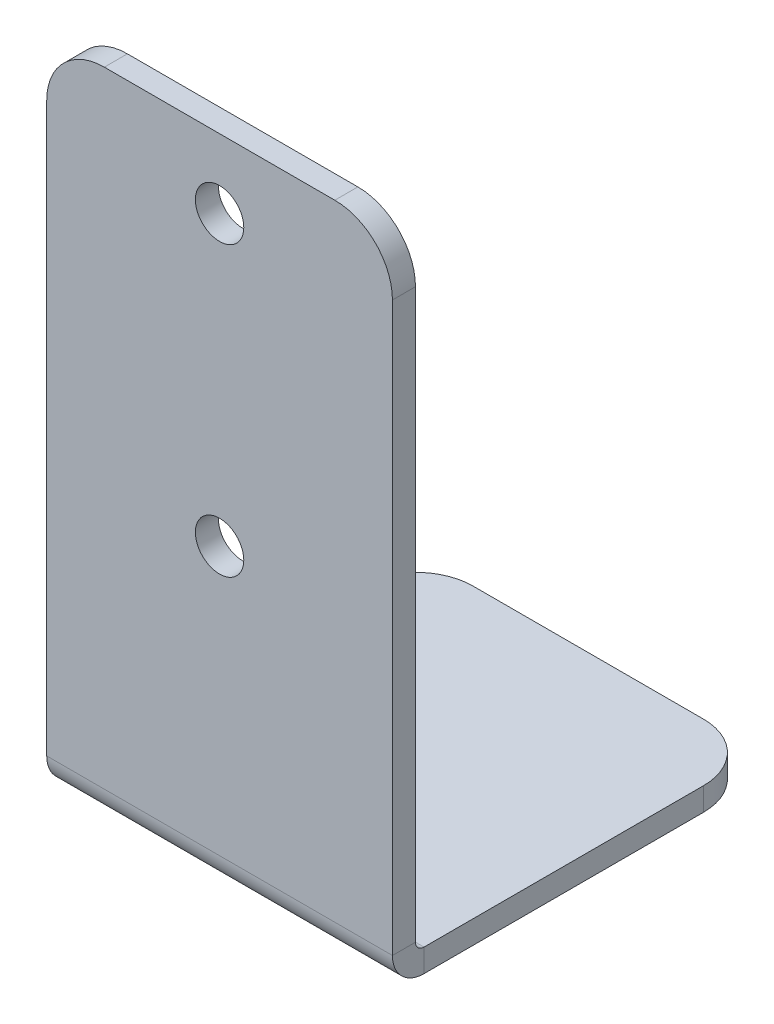
ISO-10303-21;
HEADER;
FILE_DESCRIPTION(('STEP AP214'),'2;1');
FILE_NAME('part.step','',(''),(''),'','','');
FILE_SCHEMA(('AUTOMOTIVE_DESIGN { 1 0 10303 214 1 1 1 1 }'));
ENDSEC;
DATA;
#1=APPLICATION_CONTEXT('core data for automotive mechanical design processes');
#2=APPLICATION_PROTOCOL_DEFINITION('international standard','automotive_design',2000,#1);
#3=PRODUCT_CONTEXT('',#1,'mechanical');
#4=PRODUCT('Part','Part','',(#3));
#5=PRODUCT_RELATED_PRODUCT_CATEGORY('part','',(#4));
#6=PRODUCT_DEFINITION_FORMATION('','',#4);
#7=PRODUCT_DEFINITION_CONTEXT('part definition',#1,'design');
#8=PRODUCT_DEFINITION('design','',#6,#7);
#9=PRODUCT_DEFINITION_SHAPE('','',#8);
#10=(LENGTH_UNIT() NAMED_UNIT(*) SI_UNIT(.MILLI.,.METRE.));
#11=(NAMED_UNIT(*) PLANE_ANGLE_UNIT() SI_UNIT($,.RADIAN.));
#12=(NAMED_UNIT(*) SI_UNIT($,.STERADIAN.) SOLID_ANGLE_UNIT());
#13=UNCERTAINTY_MEASURE_WITH_UNIT(LENGTH_MEASURE(1.E-05),#10,'distance_accuracy_value','');
#14=(GEOMETRIC_REPRESENTATION_CONTEXT(3) GLOBAL_UNCERTAINTY_ASSIGNED_CONTEXT((#13)) GLOBAL_UNIT_ASSIGNED_CONTEXT((#10,
#11,#12)) REPRESENTATION_CONTEXT('',''));
#15=CARTESIAN_POINT('',(0.,0.,0.));
#16=DIRECTION('',(0.,0.,1.));
#17=DIRECTION('',(1.,0.,0.));
#18=AXIS2_PLACEMENT_3D('',#15,#16,#17);
#19=CARTESIAN_POINT('',(15.,-55.,-0.7366));
#20=DIRECTION('',(1.,0.,0.));
#21=DIRECTION('',(0.,0.,-1.));
#22=AXIS2_PLACEMENT_3D('',#19,#20,#21);
#23=PLANE('',#22);
#24=DIRECTION('',(0.,-1.,0.));
#25=VECTOR('',#24,1.);
#26=CARTESIAN_POINT('',(15.,-55.,-0.7366));
#27=LINE('',#26,#25);
#28=CARTESIAN_POINT('',(15.,-55.,-0.7366));
#29=VERTEX_POINT('',#28);
#30=CARTESIAN_POINT('',(15.,-57.,-0.7366));
#31=VERTEX_POINT('',#30);
#32=EDGE_CURVE('E131',#29,#31,#27,.T.);
#33=ORIENTED_EDGE('',*,*,#32,.F.);
#34=CARTESIAN_POINT('',(15.,-54.2634,-0.7366));
#35=DIRECTION('',(-1.,0.,0.));
#36=DIRECTION('',(0.,0.,1.));
#37=AXIS2_PLACEMENT_3D('',#34,#35,#36);
#38=CIRCLE('',#37,0.7366);
#39=CARTESIAN_POINT('',(15.,-54.2634,0.));
#40=VERTEX_POINT('',#39);
#41=EDGE_CURVE('E135',#40,#29,#38,.F.);
#42=ORIENTED_EDGE('',*,*,#41,.F.);
#43=DIRECTION('',(0.,0.,-1.));
#44=VECTOR('',#43,1.);
#45=CARTESIAN_POINT('',(15.,-54.2634,2.));
#46=LINE('',#45,#44);
#47=CARTESIAN_POINT('',(15.,-54.2634,2.));
#48=VERTEX_POINT('',#47);
#49=EDGE_CURVE('E143',#48,#40,#46,.T.);
#50=ORIENTED_EDGE('',*,*,#49,.F.);
#51=CARTESIAN_POINT('',(15.,-54.2634,-0.7366));
#52=DIRECTION('',(1.,0.,0.));
#53=DIRECTION('',(0.,0.,-1.));
#54=AXIS2_PLACEMENT_3D('',#51,#52,#53);
#55=CIRCLE('',#54,2.7366);
#56=EDGE_CURVE('E137',#48,#31,#55,.T.);
#57=ORIENTED_EDGE('',*,*,#56,.T.);
#58=EDGE_LOOP('',(#33,#42,#50,#57));
#59=FACE_BOUND('',#58,.T.);
#60=ADVANCED_FACE('F41',(#59),#23,.T.);
#61=CARTESIAN_POINT('',(15.,-54.2634,2.));
#62=DIRECTION('',(1.,0.,0.));
#63=DIRECTION('',(0.,0.,-1.));
#64=AXIS2_PLACEMENT_3D('',#61,#62,#63);
#65=PLANE('',#64);
#66=DIRECTION('',(0.,0.,-1.));
#67=VECTOR('',#66,1.);
#68=CARTESIAN_POINT('',(15.,-57.,0.));
#69=LINE('',#68,#67);
#70=CARTESIAN_POINT('',(15.,-57.,-25.));
#71=VERTEX_POINT('',#70);
#72=EDGE_CURVE('E164',#31,#71,#69,.T.);
#73=ORIENTED_EDGE('',*,*,#72,.T.);
#74=DIRECTION('',(0.,-1.,0.));
#75=VECTOR('',#74,1.);
#76=CARTESIAN_POINT('',(15.,-54.2634,-25.));
#77=LINE('',#76,#75);
#78=CARTESIAN_POINT('',(15.,-55.,-25.));
#79=VERTEX_POINT('',#78);
#80=EDGE_CURVE('E163',#71,#79,#77,.F.);
#81=ORIENTED_EDGE('',*,*,#80,.T.);
#82=DIRECTION('',(0.,0.,-1.));
#83=VECTOR('',#82,1.);
#84=CARTESIAN_POINT('',(15.,-55.,0.));
#85=LINE('',#84,#83);
#86=EDGE_CURVE('E151',#29,#79,#85,.T.);
#87=ORIENTED_EDGE('',*,*,#86,.F.);
#88=ORIENTED_EDGE('',*,*,#32,.T.);
#89=EDGE_LOOP('',(#73,#81,#87,#88));
#90=FACE_BOUND('',#89,.T.);
#91=ADVANCED_FACE('F161',(#90),#65,.T.);
#92=CARTESIAN_POINT('',(-15.,-54.2634,0.));
#93=DIRECTION('',(-1.,0.,0.));
#94=DIRECTION('',(0.,0.,1.));
#95=AXIS2_PLACEMENT_3D('',#92,#93,#94);
#96=PLANE('',#95);
#97=DIRECTION('',(0.,0.,1.));
#98=VECTOR('',#97,1.);
#99=CARTESIAN_POINT('',(-15.,-54.2634,0.));
#100=LINE('',#99,#98);
#101=CARTESIAN_POINT('',(-15.,-54.2634,0.));
#102=VERTEX_POINT('',#101);
#103=CARTESIAN_POINT('',(-15.,-54.2634,2.));
#104=VERTEX_POINT('',#103);
#105=EDGE_CURVE('E209',#102,#104,#100,.T.);
#106=ORIENTED_EDGE('',*,*,#105,.F.);
#107=CARTESIAN_POINT('',(-15.,-54.2634,-0.7366));
#108=DIRECTION('',(-1.,0.,0.));
#109=DIRECTION('',(0.,0.,1.));
#110=AXIS2_PLACEMENT_3D('',#107,#108,#109);
#111=CIRCLE('',#110,0.7366);
#112=CARTESIAN_POINT('',(-15.,-55.,-0.7366));
#113=VERTEX_POINT('',#112);
#114=EDGE_CURVE('E183',#102,#113,#111,.F.);
#115=ORIENTED_EDGE('',*,*,#114,.T.);
#116=DIRECTION('',(0.,1.,0.));
#117=VECTOR('',#116,1.);
#118=CARTESIAN_POINT('',(-15.,-57.,-0.7366));
#119=LINE('',#118,#117);
#120=CARTESIAN_POINT('',(-15.,-57.,-0.7366));
#121=VERTEX_POINT('',#120);
#122=EDGE_CURVE('E207',#121,#113,#119,.T.);
#123=ORIENTED_EDGE('',*,*,#122,.F.);
#124=CARTESIAN_POINT('',(-15.,-54.2634,-0.7366));
#125=DIRECTION('',(1.,0.,0.));
#126=DIRECTION('',(0.,0.,-1.));
#127=AXIS2_PLACEMENT_3D('',#124,#125,#126);
#128=CIRCLE('',#127,2.7366);
#129=EDGE_CURVE('E189',#104,#121,#128,.T.);
#130=ORIENTED_EDGE('',*,*,#129,.F.);
#131=EDGE_LOOP('',(#106,#115,#123,#130));
#132=FACE_BOUND('',#131,.T.);
#133=ADVANCED_FACE('F310',(#132),#96,.T.);
#134=CARTESIAN_POINT('',(-15.,-57.,-0.7366));
#135=DIRECTION('',(-1.,0.,0.));
#136=DIRECTION('',(0.,0.,1.));
#137=AXIS2_PLACEMENT_3D('',#134,#135,#136);
#138=PLANE('',#137);
#139=DIRECTION('',(0.,1.,0.));
#140=VECTOR('',#139,1.);
#141=CARTESIAN_POINT('',(-15.,0.,2.));
#142=LINE('',#141,#140);
#143=CARTESIAN_POINT('',(-15.,-5.,2.));
#144=VERTEX_POINT('',#143);
#145=EDGE_CURVE('E187',#144,#104,#142,.F.);
#146=ORIENTED_EDGE('',*,*,#145,.F.);
#147=DIRECTION('',(0.,0.,-1.));
#148=VECTOR('',#147,1.);
#149=CARTESIAN_POINT('',(-15.,-5.,-0.7366));
#150=LINE('',#149,#148);
#151=CARTESIAN_POINT('',(-15.,-5.,0.));
#152=VERTEX_POINT('',#151);
#153=EDGE_CURVE('E230',#144,#152,#150,.T.);
#154=ORIENTED_EDGE('',*,*,#153,.T.);
#155=DIRECTION('',(0.,-1.,0.));
#156=VECTOR('',#155,1.);
#157=CARTESIAN_POINT('',(-15.,0.,0.));
#158=LINE('',#157,#156);
#159=EDGE_CURVE('E185',#152,#102,#158,.T.);
#160=ORIENTED_EDGE('',*,*,#159,.T.);
#161=ORIENTED_EDGE('',*,*,#105,.T.);
#162=EDGE_LOOP('',(#146,#154,#160,#161));
#163=FACE_BOUND('',#162,.T.);
#164=ADVANCED_FACE('F250',(#163),#138,.T.);
#165=CARTESIAN_POINT('',(15.,-57.,0.));
#166=DIRECTION('',(0.,1.,0.));
#167=DIRECTION('',(0.,0.,1.));
#168=AXIS2_PLACEMENT_3D('',#165,#166,#167);
#169=PLANE('',#168);
#170=DIRECTION('',(-1.,0.,0.));
#171=VECTOR('',#170,1.);
#172=CARTESIAN_POINT('',(15.,-57.,-30.));
#173=LINE('',#172,#171);
#174=CARTESIAN_POINT('',(10.,-57.,-30.));
#175=VERTEX_POINT('',#174);
#176=CARTESIAN_POINT('',(-10.,-57.,-30.));
#177=VERTEX_POINT('',#176);
#178=EDGE_CURVE('E204',#175,#177,#173,.T.);
#179=ORIENTED_EDGE('',*,*,#178,.F.);
#180=CARTESIAN_POINT('',(10.,-57.,-25.));
#181=DIRECTION('',(0.,1.,0.));
#182=DIRECTION('',(0.,0.,1.));
#183=AXIS2_PLACEMENT_3D('',#180,#181,#182);
#184=CIRCLE('',#183,5.);
#185=EDGE_CURVE('E220',#175,#71,#184,.F.);
#186=ORIENTED_EDGE('',*,*,#185,.T.);
#187=ORIENTED_EDGE('',*,*,#72,.F.);
#188=DIRECTION('',(-1.,0.,0.));
#189=VECTOR('',#188,1.);
#190=CARTESIAN_POINT('',(15.,-57.,-0.7366));
#191=LINE('',#190,#189);
#192=EDGE_CURVE('E177',#31,#121,#191,.T.);
#193=ORIENTED_EDGE('',*,*,#192,.T.);
#194=DIRECTION('',(0.,0.,-1.));
#195=VECTOR('',#194,1.);
#196=CARTESIAN_POINT('',(-15.,-57.,0.));
#197=LINE('',#196,#195);
#198=CARTESIAN_POINT('',(-15.,-57.,-25.));
#199=VERTEX_POINT('',#198);
#200=EDGE_CURVE('E178',#121,#199,#197,.T.);
#201=ORIENTED_EDGE('',*,*,#200,.T.);
#202=CARTESIAN_POINT('',(-10.,-57.,-25.));
#203=DIRECTION('',(0.,1.,0.));
#204=DIRECTION('',(0.,0.,1.));
#205=AXIS2_PLACEMENT_3D('',#202,#203,#204);
#206=CIRCLE('',#205,5.);
#207=EDGE_CURVE('E218',#199,#177,#206,.F.);
#208=ORIENTED_EDGE('',*,*,#207,.T.);
#209=EDGE_LOOP('',(#179,#186,#187,#193,#201,#208));
#210=FACE_BOUND('',#209,.T.);
#211=ADVANCED_FACE('F269',(#210),#169,.F.);
#212=CARTESIAN_POINT('',(15.,-55.,-30.));
#213=DIRECTION('',(0.,0.,-1.));
#214=DIRECTION('',(-1.,0.,0.));
#215=AXIS2_PLACEMENT_3D('',#212,#213,#214);
#216=PLANE('',#215);
#217=DIRECTION('',(-1.,0.,0.));
#218=VECTOR('',#217,1.);
#219=CARTESIAN_POINT('',(15.,-55.,-30.));
#220=LINE('',#219,#218);
#221=CARTESIAN_POINT('',(10.,-55.,-30.));
#222=VERTEX_POINT('',#221);
#223=CARTESIAN_POINT('',(-10.,-55.,-30.));
#224=VERTEX_POINT('',#223);
#225=EDGE_CURVE('E158',#222,#224,#220,.T.);
#226=ORIENTED_EDGE('',*,*,#225,.F.);
#227=DIRECTION('',(0.,-1.,0.));
#228=VECTOR('',#227,1.);
#229=CARTESIAN_POINT('',(10.,-55.,-30.));
#230=LINE('',#229,#228);
#231=EDGE_CURVE('E215',#222,#175,#230,.T.);
#232=ORIENTED_EDGE('',*,*,#231,.T.);
#233=ORIENTED_EDGE('',*,*,#178,.T.);
#234=DIRECTION('',(0.,-1.,0.));
#235=VECTOR('',#234,1.);
#236=CARTESIAN_POINT('',(-10.,-55.,-30.));
#237=LINE('',#236,#235);
#238=EDGE_CURVE('E142',#177,#224,#237,.F.);
#239=ORIENTED_EDGE('',*,*,#238,.T.);
#240=EDGE_LOOP('',(#226,#232,#233,#239));
#241=FACE_BOUND('',#240,.T.);
#242=ADVANCED_FACE('F404',(#241),#216,.T.);
#243=CARTESIAN_POINT('',(15.,-55.,0.));
#244=DIRECTION('',(0.,1.,0.));
#245=DIRECTION('',(0.,0.,1.));
#246=AXIS2_PLACEMENT_3D('',#243,#244,#245);
#247=PLANE('',#246);
#248=ORIENTED_EDGE('',*,*,#86,.T.);
#249=CARTESIAN_POINT('',(10.,-55.,-25.));
#250=DIRECTION('',(0.,1.,0.));
#251=DIRECTION('',(0.,0.,1.));
#252=AXIS2_PLACEMENT_3D('',#249,#250,#251);
#253=CIRCLE('',#252,5.);
#254=EDGE_CURVE('E225',#79,#222,#253,.T.);
#255=ORIENTED_EDGE('',*,*,#254,.T.);
#256=ORIENTED_EDGE('',*,*,#225,.T.);
#257=CARTESIAN_POINT('',(-10.,-55.,-25.));
#258=DIRECTION('',(0.,1.,0.));
#259=DIRECTION('',(0.,0.,1.));
#260=AXIS2_PLACEMENT_3D('',#257,#258,#259);
#261=CIRCLE('',#260,5.);
#262=CARTESIAN_POINT('',(-15.,-55.,-25.));
#263=VERTEX_POINT('',#262);
#264=EDGE_CURVE('E223',#224,#263,#261,.T.);
#265=ORIENTED_EDGE('',*,*,#264,.T.);
#266=DIRECTION('',(0.,0.,-1.));
#267=VECTOR('',#266,1.);
#268=CARTESIAN_POINT('',(-15.,-55.,0.));
#269=LINE('',#268,#267);
#270=EDGE_CURVE('E154',#113,#263,#269,.T.);
#271=ORIENTED_EDGE('',*,*,#270,.F.);
#272=DIRECTION('',(-1.,0.,0.));
#273=VECTOR('',#272,1.);
#274=CARTESIAN_POINT('',(15.,-55.,-0.7366));
#275=LINE('',#274,#273);
#276=EDGE_CURVE('E149',#29,#113,#275,.T.);
#277=ORIENTED_EDGE('',*,*,#276,.F.);
#278=EDGE_LOOP('',(#248,#255,#256,#265,#271,#277));
#279=FACE_BOUND('',#278,.T.);
#280=ADVANCED_FACE('F150',(#279),#247,.T.);
#281=CARTESIAN_POINT('',(15.,-54.2634,-0.7366));
#282=DIRECTION('',(-1.,0.,0.));
#283=DIRECTION('',(0.,0.,1.));
#284=AXIS2_PLACEMENT_3D('',#281,#282,#283);
#285=CYLINDRICAL_SURFACE('',#284,0.7366);
#286=ORIENTED_EDGE('',*,*,#114,.F.);
#287=DIRECTION('',(-1.,0.,0.));
#288=VECTOR('',#287,1.);
#289=CARTESIAN_POINT('',(15.,-54.2634,0.));
#290=LINE('',#289,#288);
#291=EDGE_CURVE('E159',#40,#102,#290,.T.);
#292=ORIENTED_EDGE('',*,*,#291,.F.);
#293=ORIENTED_EDGE('',*,*,#41,.T.);
#294=ORIENTED_EDGE('',*,*,#276,.T.);
#295=EDGE_LOOP('',(#286,#292,#293,#294));
#296=FACE_BOUND('',#295,.T.);
#297=ADVANCED_FACE('F167',(#296),#285,.F.);
#298=CARTESIAN_POINT('',(15.,0.,0.));
#299=DIRECTION('',(0.,0.,-1.));
#300=DIRECTION('',(-1.,0.,0.));
#301=AXIS2_PLACEMENT_3D('',#298,#299,#300);
#302=PLANE('',#301);
#303=CARTESIAN_POINT('',(0.,-31.,0.));
#304=DIRECTION('',(0.,0.,-1.));
#305=DIRECTION('',(-1.,0.,0.));
#306=AXIS2_PLACEMENT_3D('',#303,#304,#305);
#307=CIRCLE('',#306,2.09999999999998);
#308=CARTESIAN_POINT('',(-2.09999999999998,-31.,0.));
#309=VERTEX_POINT('',#308);
#310=EDGE_CURVE('E276',#309,#309,#307,.T.);
#311=ORIENTED_EDGE('',*,*,#310,.F.);
#312=EDGE_LOOP('',(#311));
#313=FACE_BOUND('',#312,.T.);
#314=CARTESIAN_POINT('',(0.,-6.,0.));
#315=DIRECTION('',(0.,0.,-1.));
#316=DIRECTION('',(-1.,0.,0.));
#317=AXIS2_PLACEMENT_3D('',#314,#315,#316);
#318=CIRCLE('',#317,2.09999999999998);
#319=CARTESIAN_POINT('',(-2.09999999999998,-6.,0.));
#320=VERTEX_POINT('',#319);
#321=EDGE_CURVE('E181',#320,#320,#318,.T.);
#322=ORIENTED_EDGE('',*,*,#321,.F.);
#323=EDGE_LOOP('',(#322));
#324=FACE_BOUND('',#323,.T.);
#325=ORIENTED_EDGE('',*,*,#159,.F.);
#326=CARTESIAN_POINT('',(-10.,-5.,0.));
#327=DIRECTION('',(0.,0.,-1.));
#328=DIRECTION('',(-1.,0.,0.));
#329=AXIS2_PLACEMENT_3D('',#326,#327,#328);
#330=CIRCLE('',#329,5.);
#331=CARTESIAN_POINT('',(-10.,0.,0.));
#332=VERTEX_POINT('',#331);
#333=EDGE_CURVE('E235',#152,#332,#330,.T.);
#334=ORIENTED_EDGE('',*,*,#333,.T.);
#335=DIRECTION('',(-1.,0.,0.));
#336=VECTOR('',#335,1.);
#337=CARTESIAN_POINT('',(15.,0.,0.));
#338=LINE('',#337,#336);
#339=CARTESIAN_POINT('',(10.,0.,0.));
#340=VERTEX_POINT('',#339);
#341=EDGE_CURVE('E199',#340,#332,#338,.T.);
#342=ORIENTED_EDGE('',*,*,#341,.F.);
#343=CARTESIAN_POINT('',(10.,-5.,0.));
#344=DIRECTION('',(0.,0.,-1.));
#345=DIRECTION('',(-1.,0.,0.));
#346=AXIS2_PLACEMENT_3D('',#343,#344,#345);
#347=CIRCLE('',#346,5.);
#348=CARTESIAN_POINT('',(15.,-5.,0.));
#349=VERTEX_POINT('',#348);
#350=EDGE_CURVE('E233',#340,#349,#347,.T.);
#351=ORIENTED_EDGE('',*,*,#350,.T.);
#352=DIRECTION('',(0.,-1.,0.));
#353=VECTOR('',#352,1.);
#354=CARTESIAN_POINT('',(15.,0.,0.));
#355=LINE('',#354,#353);
#356=EDGE_CURVE('E169',#349,#40,#355,.T.);
#357=ORIENTED_EDGE('',*,*,#356,.T.);
#358=ORIENTED_EDGE('',*,*,#291,.T.);
#359=EDGE_LOOP('',(#325,#334,#342,#351,#357,#358));
#360=FACE_BOUND('',#359,.T.);
#361=ADVANCED_FACE('F256',(#313,#324,#360),#302,.T.);
#362=CARTESIAN_POINT('',(15.,0.,2.));
#363=DIRECTION('',(0.,1.,0.));
#364=DIRECTION('',(0.,0.,1.));
#365=AXIS2_PLACEMENT_3D('',#362,#363,#364);
#366=PLANE('',#365);
#367=ORIENTED_EDGE('',*,*,#341,.T.);
#368=DIRECTION('',(0.,0.,-1.));
#369=VECTOR('',#368,1.);
#370=CARTESIAN_POINT('',(-10.,0.,2.));
#371=LINE('',#370,#369);
#372=CARTESIAN_POINT('',(-10.,0.,2.));
#373=VERTEX_POINT('',#372);
#374=EDGE_CURVE('E62',#332,#373,#371,.F.);
#375=ORIENTED_EDGE('',*,*,#374,.T.);
#376=DIRECTION('',(-1.,0.,0.));
#377=VECTOR('',#376,1.);
#378=CARTESIAN_POINT('',(15.,0.,2.));
#379=LINE('',#378,#377);
#380=CARTESIAN_POINT('',(10.,0.,2.));
#381=VERTEX_POINT('',#380);
#382=EDGE_CURVE('E197',#381,#373,#379,.T.);
#383=ORIENTED_EDGE('',*,*,#382,.F.);
#384=DIRECTION('',(0.,0.,-1.));
#385=VECTOR('',#384,1.);
#386=CARTESIAN_POINT('',(10.,0.,0.));
#387=LINE('',#386,#385);
#388=EDGE_CURVE('E237',#381,#340,#387,.T.);
#389=ORIENTED_EDGE('',*,*,#388,.T.);
#390=EDGE_LOOP('',(#367,#375,#383,#389));
#391=FACE_BOUND('',#390,.T.);
#392=ADVANCED_FACE('F257',(#391),#366,.T.);
#393=CARTESIAN_POINT('',(15.,0.,2.));
#394=DIRECTION('',(0.,0.,-1.));
#395=DIRECTION('',(-1.,0.,0.));
#396=AXIS2_PLACEMENT_3D('',#393,#394,#395);
#397=PLANE('',#396);
#398=CARTESIAN_POINT('',(0.,-31.,2.));
#399=DIRECTION('',(0.,0.,1.));
#400=DIRECTION('',(1.,0.,0.));
#401=AXIS2_PLACEMENT_3D('',#398,#399,#400);
#402=CIRCLE('',#401,2.09999999999999);
#403=CARTESIAN_POINT('',(2.09999999999999,-31.,2.));
#404=VERTEX_POINT('',#403);
#405=EDGE_CURVE('E279',#404,#404,#402,.T.);
#406=ORIENTED_EDGE('',*,*,#405,.F.);
#407=EDGE_LOOP('',(#406));
#408=FACE_BOUND('',#407,.T.);
#409=CARTESIAN_POINT('',(0.,-6.,2.));
#410=DIRECTION('',(0.,0.,1.));
#411=DIRECTION('',(1.,0.,0.));
#412=AXIS2_PLACEMENT_3D('',#409,#410,#411);
#413=CIRCLE('',#412,2.09999999999999);
#414=CARTESIAN_POINT('',(2.09999999999999,-6.,2.));
#415=VERTEX_POINT('',#414);
#416=EDGE_CURVE('E273',#415,#415,#413,.T.);
#417=ORIENTED_EDGE('',*,*,#416,.F.);
#418=EDGE_LOOP('',(#417));
#419=FACE_BOUND('',#418,.T.);
#420=ORIENTED_EDGE('',*,*,#382,.T.);
#421=CARTESIAN_POINT('',(-10.,-5.,2.));
#422=DIRECTION('',(0.,0.,-1.));
#423=DIRECTION('',(-1.,0.,0.));
#424=AXIS2_PLACEMENT_3D('',#421,#422,#423);
#425=CIRCLE('',#424,5.);
#426=EDGE_CURVE('E49',#373,#144,#425,.F.);
#427=ORIENTED_EDGE('',*,*,#426,.T.);
#428=ORIENTED_EDGE('',*,*,#145,.T.);
#429=DIRECTION('',(-1.,0.,0.));
#430=VECTOR('',#429,1.);
#431=CARTESIAN_POINT('',(15.,-54.2634,2.));
#432=LINE('',#431,#430);
#433=EDGE_CURVE('E194',#48,#104,#432,.T.);
#434=ORIENTED_EDGE('',*,*,#433,.F.);
#435=DIRECTION('',(0.,1.,0.));
#436=VECTOR('',#435,1.);
#437=CARTESIAN_POINT('',(15.,0.,2.));
#438=LINE('',#437,#436);
#439=CARTESIAN_POINT('',(15.,-5.,2.));
#440=VERTEX_POINT('',#439);
#441=EDGE_CURVE('E171',#440,#48,#438,.F.);
#442=ORIENTED_EDGE('',*,*,#441,.F.);
#443=CARTESIAN_POINT('',(10.,-5.,2.));
#444=DIRECTION('',(0.,0.,-1.));
#445=DIRECTION('',(-1.,0.,0.));
#446=AXIS2_PLACEMENT_3D('',#443,#444,#445);
#447=CIRCLE('',#446,5.);
#448=EDGE_CURVE('E241',#440,#381,#447,.F.);
#449=ORIENTED_EDGE('',*,*,#448,.T.);
#450=EDGE_LOOP('',(#420,#427,#428,#434,#442,#449));
#451=FACE_BOUND('',#450,.T.);
#452=ADVANCED_FACE('F245',(#408,#419,#451),#397,.F.);
#453=CARTESIAN_POINT('',(15.,-54.2634,-0.7366));
#454=DIRECTION('',(-1.,0.,0.));
#455=DIRECTION('',(0.,0.,1.));
#456=AXIS2_PLACEMENT_3D('',#453,#454,#455);
#457=CYLINDRICAL_SURFACE('',#456,2.7366);
#458=ORIENTED_EDGE('',*,*,#129,.T.);
#459=ORIENTED_EDGE('',*,*,#192,.F.);
#460=ORIENTED_EDGE('',*,*,#56,.F.);
#461=ORIENTED_EDGE('',*,*,#433,.T.);
#462=EDGE_LOOP('',(#458,#459,#460,#461));
#463=FACE_BOUND('',#462,.T.);
#464=ADVANCED_FACE('F264',(#463),#457,.T.);
#465=CARTESIAN_POINT('',(15.,-54.2634,-0.7366));
#466=DIRECTION('',(-1.,0.,0.));
#467=DIRECTION('',(0.,0.,1.));
#468=AXIS2_PLACEMENT_3D('',#465,#466,#467);
#469=PLANE('',#468);
#470=ORIENTED_EDGE('',*,*,#356,.F.);
#471=DIRECTION('',(0.,0.,-1.));
#472=VECTOR('',#471,1.);
#473=CARTESIAN_POINT('',(15.,-5.,2.));
#474=LINE('',#473,#472);
#475=EDGE_CURVE('E11',#349,#440,#474,.F.);
#476=ORIENTED_EDGE('',*,*,#475,.T.);
#477=ORIENTED_EDGE('',*,*,#441,.T.);
#478=ORIENTED_EDGE('',*,*,#49,.T.);
#479=EDGE_LOOP('',(#470,#476,#477,#478));
#480=FACE_BOUND('',#479,.T.);
#481=ADVANCED_FACE('F261',(#480),#469,.F.);
#482=CARTESIAN_POINT('',(-15.,-54.2634,-0.7366));
#483=DIRECTION('',(-1.,0.,0.));
#484=DIRECTION('',(0.,0.,1.));
#485=AXIS2_PLACEMENT_3D('',#482,#483,#484);
#486=PLANE('',#485);
#487=ORIENTED_EDGE('',*,*,#270,.T.);
#488=DIRECTION('',(0.,-1.,0.));
#489=VECTOR('',#488,1.);
#490=CARTESIAN_POINT('',(-15.,-54.2634,-25.));
#491=LINE('',#490,#489);
#492=EDGE_CURVE('E227',#263,#199,#491,.T.);
#493=ORIENTED_EDGE('',*,*,#492,.T.);
#494=ORIENTED_EDGE('',*,*,#200,.F.);
#495=ORIENTED_EDGE('',*,*,#122,.T.);
#496=EDGE_LOOP('',(#487,#493,#494,#495));
#497=FACE_BOUND('',#496,.T.);
#498=ADVANCED_FACE('F292',(#497),#486,.T.);
#499=CARTESIAN_POINT('',(0.,-6.,2.));
#500=DIRECTION('',(0.,0.,1.));
#501=DIRECTION('',(1.,0.,0.));
#502=AXIS2_PLACEMENT_3D('',#499,#500,#501);
#503=CYLINDRICAL_SURFACE('',#502,2.09999999999998);
#504=ORIENTED_EDGE('',*,*,#321,.T.);
#505=EDGE_LOOP('',(#504));
#506=FACE_BOUND('',#505,.T.);
#507=ORIENTED_EDGE('',*,*,#416,.T.);
#508=EDGE_LOOP('',(#507));
#509=FACE_BOUND('',#508,.T.);
#510=ADVANCED_FACE('F290',(#506,#509),#503,.F.);
#511=CARTESIAN_POINT('',(0.,-31.,2.));
#512=DIRECTION('',(0.,0.,1.));
#513=DIRECTION('',(1.,0.,0.));
#514=AXIS2_PLACEMENT_3D('',#511,#512,#513);
#515=CYLINDRICAL_SURFACE('',#514,2.09999999999998);
#516=ORIENTED_EDGE('',*,*,#310,.T.);
#517=EDGE_LOOP('',(#516));
#518=FACE_BOUND('',#517,.T.);
#519=ORIENTED_EDGE('',*,*,#405,.T.);
#520=EDGE_LOOP('',(#519));
#521=FACE_BOUND('',#520,.T.);
#522=ADVANCED_FACE('F283',(#518,#521),#515,.F.);
#523=CARTESIAN_POINT('',(10.,-55.,-25.));
#524=DIRECTION('',(0.,-1.,0.));
#525=DIRECTION('',(0.,0.,-1.));
#526=AXIS2_PLACEMENT_3D('',#523,#524,#525);
#527=CYLINDRICAL_SURFACE('',#526,5.);
#528=ORIENTED_EDGE('',*,*,#254,.F.);
#529=ORIENTED_EDGE('',*,*,#80,.F.);
#530=ORIENTED_EDGE('',*,*,#185,.F.);
#531=ORIENTED_EDGE('',*,*,#231,.F.);
#532=EDGE_LOOP('',(#528,#529,#530,#531));
#533=FACE_BOUND('',#532,.T.);
#534=ADVANCED_FACE('F299',(#533),#527,.T.);
#535=CARTESIAN_POINT('',(-10.,-54.2634,-25.));
#536=DIRECTION('',(0.,-1.,0.));
#537=DIRECTION('',(0.,0.,-1.));
#538=AXIS2_PLACEMENT_3D('',#535,#536,#537);
#539=CYLINDRICAL_SURFACE('',#538,5.);
#540=ORIENTED_EDGE('',*,*,#264,.F.);
#541=ORIENTED_EDGE('',*,*,#238,.F.);
#542=ORIENTED_EDGE('',*,*,#207,.F.);
#543=ORIENTED_EDGE('',*,*,#492,.F.);
#544=EDGE_LOOP('',(#540,#541,#542,#543));
#545=FACE_BOUND('',#544,.T.);
#546=ADVANCED_FACE('F316',(#545),#539,.T.);
#547=CARTESIAN_POINT('',(-10.,-5.,-0.7366));
#548=DIRECTION('',(0.,0.,-1.));
#549=DIRECTION('',(-1.,0.,0.));
#550=AXIS2_PLACEMENT_3D('',#547,#548,#549);
#551=CYLINDRICAL_SURFACE('',#550,5.);
#552=ORIENTED_EDGE('',*,*,#426,.F.);
#553=ORIENTED_EDGE('',*,*,#374,.F.);
#554=ORIENTED_EDGE('',*,*,#333,.F.);
#555=ORIENTED_EDGE('',*,*,#153,.F.);
#556=EDGE_LOOP('',(#552,#553,#554,#555));
#557=FACE_BOUND('',#556,.T.);
#558=ADVANCED_FACE('F253',(#557),#551,.T.);
#559=CARTESIAN_POINT('',(10.,-5.,2.));
#560=DIRECTION('',(0.,0.,1.));
#561=DIRECTION('',(1.,0.,0.));
#562=AXIS2_PLACEMENT_3D('',#559,#560,#561);
#563=CYLINDRICAL_SURFACE('',#562,5.);
#564=ORIENTED_EDGE('',*,*,#448,.F.);
#565=ORIENTED_EDGE('',*,*,#475,.F.);
#566=ORIENTED_EDGE('',*,*,#350,.F.);
#567=ORIENTED_EDGE('',*,*,#388,.F.);
#568=EDGE_LOOP('',(#564,#565,#566,#567));
#569=FACE_BOUND('',#568,.T.);
#570=ADVANCED_FACE('F43',(#569),#563,.T.);
#571=CLOSED_SHELL('',(#60,#91,#133,#164,#211,#242,#280,#297,#361,#392,#452,#464,#481,#498,#510,
#522,#534,#546,#558,#570));
#572=MANIFOLD_SOLID_BREP('B2',#571);
#573=ADVANCED_BREP_SHAPE_REPRESENTATION('',(#18,#572),#14);
#574=SHAPE_DEFINITION_REPRESENTATION(#9,#573);
ENDSEC;
END-ISO-10303-21;
